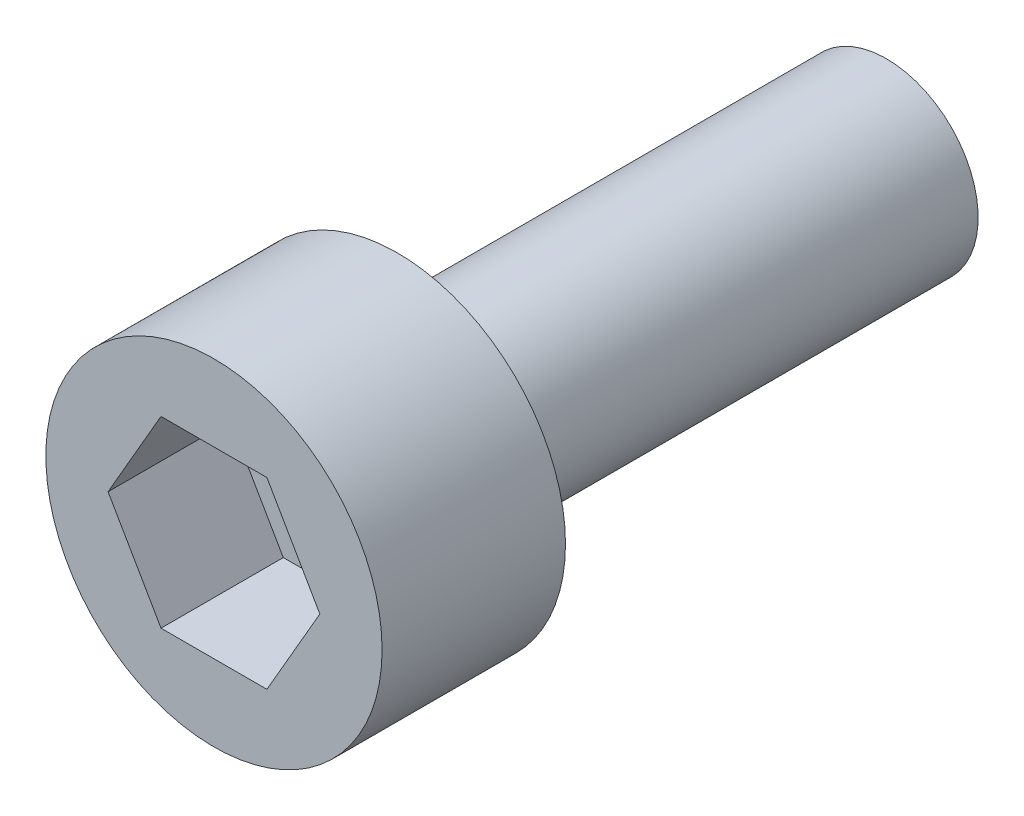
ISO-10303-21;
HEADER;
FILE_DESCRIPTION(('STEP AP214'),'2;1');
FILE_NAME('part.step','',(''),(''),'','','');
FILE_SCHEMA(('AUTOMOTIVE_DESIGN { 1 0 10303 214 1 1 1 1 }'));
ENDSEC;
DATA;
#1=APPLICATION_CONTEXT('core data for automotive mechanical design processes');
#2=APPLICATION_PROTOCOL_DEFINITION('international standard','automotive_design',2000,#1);
#3=PRODUCT_CONTEXT('',#1,'mechanical');
#4=PRODUCT('Part','Part','',(#3));
#5=PRODUCT_RELATED_PRODUCT_CATEGORY('part','',(#4));
#6=PRODUCT_DEFINITION_FORMATION('','',#4);
#7=PRODUCT_DEFINITION_CONTEXT('part definition',#1,'design');
#8=PRODUCT_DEFINITION('design','',#6,#7);
#9=PRODUCT_DEFINITION_SHAPE('','',#8);
#10=(LENGTH_UNIT() NAMED_UNIT(*) SI_UNIT(.MILLI.,.METRE.));
#11=(NAMED_UNIT(*) PLANE_ANGLE_UNIT() SI_UNIT($,.RADIAN.));
#12=(NAMED_UNIT(*) SI_UNIT($,.STERADIAN.) SOLID_ANGLE_UNIT());
#13=UNCERTAINTY_MEASURE_WITH_UNIT(LENGTH_MEASURE(1.E-05),#10,'distance_accuracy_value','');
#14=(GEOMETRIC_REPRESENTATION_CONTEXT(3) GLOBAL_UNCERTAINTY_ASSIGNED_CONTEXT((#13)) GLOBAL_UNIT_ASSIGNED_CONTEXT((#10,
#11,#12)) REPRESENTATION_CONTEXT('',''));
#15=CARTESIAN_POINT('',(0.,0.,0.));
#16=DIRECTION('',(0.,0.,1.));
#17=DIRECTION('',(1.,0.,0.));
#18=AXIS2_PLACEMENT_3D('',#15,#16,#17);
#19=CARTESIAN_POINT('',(0.866025403784438,-1.5,3.));
#20=DIRECTION('',(-0.866025403784439,0.5,0.));
#21=DIRECTION('',(-0.5,-0.866025403784439,0.));
#22=AXIS2_PLACEMENT_3D('',#19,#20,#21);
#23=PLANE('',#22);
#24=DIRECTION('',(0.,0.,-1.));
#25=VECTOR('',#24,1.);
#26=CARTESIAN_POINT('',(1.73205080756888,0.,3.));
#27=LINE('',#26,#25);
#28=CARTESIAN_POINT('',(1.73205080756888,0.,3.));
#29=VERTEX_POINT('',#28);
#30=CARTESIAN_POINT('',(1.73205080756888,0.,1.));
#31=VERTEX_POINT('',#30);
#32=EDGE_CURVE('E119',#29,#31,#27,.T.);
#33=ORIENTED_EDGE('',*,*,#32,.T.);
#34=DIRECTION('',(-0.5,-0.866025403784439,0.));
#35=VECTOR('',#34,1.);
#36=CARTESIAN_POINT('',(1.29903810567666,-0.75,1.));
#37=LINE('',#36,#35);
#38=CARTESIAN_POINT('',(0.866025403784438,-1.5,1.));
#39=VERTEX_POINT('',#38);
#40=EDGE_CURVE('E180',#31,#39,#37,.T.);
#41=ORIENTED_EDGE('',*,*,#40,.T.);
#42=DIRECTION('',(0.,0.,-1.));
#43=VECTOR('',#42,1.);
#44=CARTESIAN_POINT('',(0.866025403784438,-1.5,3.));
#45=LINE('',#44,#43);
#46=CARTESIAN_POINT('',(0.866025403784438,-1.5,3.));
#47=VERTEX_POINT('',#46);
#48=EDGE_CURVE('E197',#47,#39,#45,.T.);
#49=ORIENTED_EDGE('',*,*,#48,.F.);
#50=DIRECTION('',(0.5,0.866025403784439,0.));
#51=VECTOR('',#50,1.);
#52=CARTESIAN_POINT('',(0.866025403784438,-1.5,3.));
#53=LINE('',#52,#51);
#54=EDGE_CURVE('E186',#47,#29,#53,.T.);
#55=ORIENTED_EDGE('',*,*,#54,.T.);
#56=EDGE_LOOP('',(#33,#41,#49,#55));
#57=FACE_BOUND('',#56,.T.);
#58=ADVANCED_FACE('F40',(#57),#23,.T.);
#59=CARTESIAN_POINT('',(1.73205080756888,0.,3.));
#60=DIRECTION('',(-0.866025403784438,-0.5,0.));
#61=DIRECTION('',(0.5,-0.866025403784439,0.));
#62=AXIS2_PLACEMENT_3D('',#59,#60,#61);
#63=PLANE('',#62);
#64=DIRECTION('',(0.,0.,-1.));
#65=VECTOR('',#64,1.);
#66=CARTESIAN_POINT('',(0.866025403784438,1.5,3.));
#67=LINE('',#66,#65);
#68=CARTESIAN_POINT('',(0.866025403784438,1.5,3.));
#69=VERTEX_POINT('',#68);
#70=CARTESIAN_POINT('',(0.866025403784438,1.5,1.));
#71=VERTEX_POINT('',#70);
#72=EDGE_CURVE('E117',#69,#71,#67,.T.);
#73=ORIENTED_EDGE('',*,*,#72,.T.);
#74=DIRECTION('',(0.5,-0.866025403784438,0.));
#75=VECTOR('',#74,1.);
#76=CARTESIAN_POINT('',(1.29903810567666,0.750000000000001,1.));
#77=LINE('',#76,#75);
#78=EDGE_CURVE('E98',#71,#31,#77,.T.);
#79=ORIENTED_EDGE('',*,*,#78,.T.);
#80=ORIENTED_EDGE('',*,*,#32,.F.);
#81=DIRECTION('',(-0.5,0.866025403784438,0.));
#82=VECTOR('',#81,1.);
#83=CARTESIAN_POINT('',(1.73205080756888,0.,3.));
#84=LINE('',#83,#82);
#85=EDGE_CURVE('E188',#29,#69,#84,.T.);
#86=ORIENTED_EDGE('',*,*,#85,.T.);
#87=EDGE_LOOP('',(#73,#79,#80,#86));
#88=FACE_BOUND('',#87,.T.);
#89=ADVANCED_FACE('F145',(#88),#63,.T.);
#90=CARTESIAN_POINT('',(0.866025403784438,1.5,3.));
#91=DIRECTION('',(0.,-1.,0.));
#92=DIRECTION('',(0.,0.,-1.));
#93=AXIS2_PLACEMENT_3D('',#90,#91,#92);
#94=PLANE('',#93);
#95=DIRECTION('',(0.,0.,-1.));
#96=VECTOR('',#95,1.);
#97=CARTESIAN_POINT('',(-0.866025403784439,1.5,3.));
#98=LINE('',#97,#96);
#99=CARTESIAN_POINT('',(-0.866025403784439,1.5,3.));
#100=VERTEX_POINT('',#99);
#101=CARTESIAN_POINT('',(-0.866025403784439,1.5,1.));
#102=VERTEX_POINT('',#101);
#103=EDGE_CURVE('E108',#100,#102,#98,.T.);
#104=ORIENTED_EDGE('',*,*,#103,.T.);
#105=DIRECTION('',(1.,0.,0.));
#106=VECTOR('',#105,1.);
#107=CARTESIAN_POINT('',(0.,1.5,1.));
#108=LINE('',#107,#106);
#109=EDGE_CURVE('E93',#102,#71,#108,.T.);
#110=ORIENTED_EDGE('',*,*,#109,.T.);
#111=ORIENTED_EDGE('',*,*,#72,.F.);
#112=DIRECTION('',(-1.,0.,0.));
#113=VECTOR('',#112,1.);
#114=CARTESIAN_POINT('',(0.866025403784438,1.5,3.));
#115=LINE('',#114,#113);
#116=EDGE_CURVE('E116',#69,#100,#115,.T.);
#117=ORIENTED_EDGE('',*,*,#116,.T.);
#118=EDGE_LOOP('',(#104,#110,#111,#117));
#119=FACE_BOUND('',#118,.T.);
#120=ADVANCED_FACE('F114',(#119),#94,.T.);
#121=CARTESIAN_POINT('',(-0.866025403784439,1.5,3.));
#122=DIRECTION('',(0.866025403784438,-0.5,0.));
#123=DIRECTION('',(0.5,0.866025403784439,0.));
#124=AXIS2_PLACEMENT_3D('',#121,#122,#123);
#125=PLANE('',#124);
#126=DIRECTION('',(0.,0.,-1.));
#127=VECTOR('',#126,1.);
#128=CARTESIAN_POINT('',(-1.73205080756888,0.,3.));
#129=LINE('',#128,#127);
#130=CARTESIAN_POINT('',(-1.73205080756888,0.,3.));
#131=VERTEX_POINT('',#130);
#132=CARTESIAN_POINT('',(-1.73205080756888,0.,1.));
#133=VERTEX_POINT('',#132);
#134=EDGE_CURVE('E111',#131,#133,#129,.T.);
#135=ORIENTED_EDGE('',*,*,#134,.T.);
#136=DIRECTION('',(0.5,0.866025403784439,0.));
#137=VECTOR('',#136,1.);
#138=CARTESIAN_POINT('',(-1.29903810567666,0.75,1.));
#139=LINE('',#138,#137);
#140=EDGE_CURVE('E96',#133,#102,#139,.T.);
#141=ORIENTED_EDGE('',*,*,#140,.T.);
#142=ORIENTED_EDGE('',*,*,#103,.F.);
#143=DIRECTION('',(-0.5,-0.866025403784439,0.));
#144=VECTOR('',#143,1.);
#145=CARTESIAN_POINT('',(-0.866025403784439,1.5,3.));
#146=LINE('',#145,#144);
#147=EDGE_CURVE('E191',#100,#131,#146,.T.);
#148=ORIENTED_EDGE('',*,*,#147,.T.);
#149=EDGE_LOOP('',(#135,#141,#142,#148));
#150=FACE_BOUND('',#149,.T.);
#151=ADVANCED_FACE('F107',(#150),#125,.T.);
#152=CARTESIAN_POINT('',(-1.73205080756888,0.,3.));
#153=DIRECTION('',(0.866025403784439,0.5,0.));
#154=DIRECTION('',(-0.5,0.866025403784439,0.));
#155=AXIS2_PLACEMENT_3D('',#152,#153,#154);
#156=PLANE('',#155);
#157=DIRECTION('',(0.,0.,-1.));
#158=VECTOR('',#157,1.);
#159=CARTESIAN_POINT('',(-0.866025403784438,-1.5,3.));
#160=LINE('',#159,#158);
#161=CARTESIAN_POINT('',(-0.866025403784438,-1.5,3.));
#162=VERTEX_POINT('',#161);
#163=CARTESIAN_POINT('',(-0.866025403784438,-1.5,1.));
#164=VERTEX_POINT('',#163);
#165=EDGE_CURVE('E64',#162,#164,#160,.T.);
#166=ORIENTED_EDGE('',*,*,#165,.T.);
#167=DIRECTION('',(-0.5,0.866025403784439,0.));
#168=VECTOR('',#167,1.);
#169=CARTESIAN_POINT('',(-1.29903810567666,-0.75,1.));
#170=LINE('',#169,#168);
#171=EDGE_CURVE('E57',#164,#133,#170,.T.);
#172=ORIENTED_EDGE('',*,*,#171,.T.);
#173=ORIENTED_EDGE('',*,*,#134,.F.);
#174=DIRECTION('',(0.5,-0.866025403784438,0.));
#175=VECTOR('',#174,1.);
#176=CARTESIAN_POINT('',(-1.73205080756888,0.,3.));
#177=LINE('',#176,#175);
#178=EDGE_CURVE('E193',#131,#162,#177,.T.);
#179=ORIENTED_EDGE('',*,*,#178,.T.);
#180=EDGE_LOOP('',(#166,#172,#173,#179));
#181=FACE_BOUND('',#180,.T.);
#182=ADVANCED_FACE('F158',(#181),#156,.T.);
#183=CARTESIAN_POINT('',(-0.866025403784438,-1.5,3.));
#184=DIRECTION('',(0.,1.,0.));
#185=DIRECTION('',(-1.,0.,0.));
#186=AXIS2_PLACEMENT_3D('',#183,#184,#185);
#187=PLANE('',#186);
#188=ORIENTED_EDGE('',*,*,#48,.T.);
#189=DIRECTION('',(-1.,0.,0.));
#190=VECTOR('',#189,1.);
#191=CARTESIAN_POINT('',(0.,-1.5,1.));
#192=LINE('',#191,#190);
#193=EDGE_CURVE('E183',#39,#164,#192,.T.);
#194=ORIENTED_EDGE('',*,*,#193,.T.);
#195=ORIENTED_EDGE('',*,*,#165,.F.);
#196=DIRECTION('',(1.,0.,0.));
#197=VECTOR('',#196,1.);
#198=CARTESIAN_POINT('',(-0.866025403784438,-1.5,3.));
#199=LINE('',#198,#197);
#200=EDGE_CURVE('E195',#162,#47,#199,.T.);
#201=ORIENTED_EDGE('',*,*,#200,.T.);
#202=EDGE_LOOP('',(#188,#194,#195,#201));
#203=FACE_BOUND('',#202,.T.);
#204=ADVANCED_FACE('F141',(#203),#187,.T.);
#205=CARTESIAN_POINT('',(0.,0.,3.));
#206=DIRECTION('',(0.,0.,1.));
#207=DIRECTION('',(1.,0.,0.));
#208=AXIS2_PLACEMENT_3D('',#205,#206,#207);
#209=PLANE('',#208);
#210=CARTESIAN_POINT('',(0.,0.,3.));
#211=DIRECTION('',(0.,0.,1.));
#212=DIRECTION('',(1.,0.,0.));
#213=AXIS2_PLACEMENT_3D('',#210,#211,#212);
#214=CIRCLE('',#213,2.75);
#215=CARTESIAN_POINT('',(2.75,0.,3.));
#216=VERTEX_POINT('',#215);
#217=EDGE_CURVE('E49',#216,#216,#214,.T.);
#218=ORIENTED_EDGE('',*,*,#217,.T.);
#219=EDGE_LOOP('',(#218));
#220=FACE_BOUND('',#219,.T.);
#221=ORIENTED_EDGE('',*,*,#85,.F.);
#222=ORIENTED_EDGE('',*,*,#54,.F.);
#223=ORIENTED_EDGE('',*,*,#200,.F.);
#224=ORIENTED_EDGE('',*,*,#178,.F.);
#225=ORIENTED_EDGE('',*,*,#147,.F.);
#226=ORIENTED_EDGE('',*,*,#116,.F.);
#227=EDGE_LOOP('',(#221,#222,#223,#224,#225,#226));
#228=FACE_BOUND('',#227,.T.);
#229=ADVANCED_FACE('F134',(#220,#228),#209,.T.);
#230=CARTESIAN_POINT('',(0.,0.,0.));
#231=DIRECTION('',(0.,0.,1.));
#232=DIRECTION('',(1.,0.,0.));
#233=AXIS2_PLACEMENT_3D('',#230,#231,#232);
#234=PLANE('',#233);
#235=CARTESIAN_POINT('',(0.,0.,0.));
#236=DIRECTION('',(0.,0.,-1.));
#237=DIRECTION('',(-1.,0.,0.));
#238=AXIS2_PLACEMENT_3D('',#235,#236,#237);
#239=CIRCLE('',#238,1.5);
#240=CARTESIAN_POINT('',(-1.5,0.,0.));
#241=VERTEX_POINT('',#240);
#242=EDGE_CURVE('E11',#241,#241,#239,.T.);
#243=ORIENTED_EDGE('',*,*,#242,.F.);
#244=EDGE_LOOP('',(#243));
#245=FACE_BOUND('',#244,.T.);
#246=CARTESIAN_POINT('',(0.,0.,0.));
#247=DIRECTION('',(0.,0.,1.));
#248=DIRECTION('',(1.,0.,0.));
#249=AXIS2_PLACEMENT_3D('',#246,#247,#248);
#250=CIRCLE('',#249,2.75);
#251=CARTESIAN_POINT('',(2.75,0.,0.));
#252=VERTEX_POINT('',#251);
#253=EDGE_CURVE('E44',#252,#252,#250,.T.);
#254=ORIENTED_EDGE('',*,*,#253,.F.);
#255=EDGE_LOOP('',(#254));
#256=FACE_BOUND('',#255,.T.);
#257=ADVANCED_FACE('F132',(#245,#256),#234,.F.);
#258=CARTESIAN_POINT('',(0.,0.,3.));
#259=DIRECTION('',(0.,0.,-1.));
#260=DIRECTION('',(-1.,0.,0.));
#261=AXIS2_PLACEMENT_3D('',#258,#259,#260);
#262=CYLINDRICAL_SURFACE('',#261,2.75);
#263=ORIENTED_EDGE('',*,*,#217,.F.);
#264=EDGE_LOOP('',(#263));
#265=FACE_BOUND('',#264,.T.);
#266=ORIENTED_EDGE('',*,*,#253,.T.);
#267=EDGE_LOOP('',(#266));
#268=FACE_BOUND('',#267,.T.);
#269=ADVANCED_FACE('F42',(#265,#268),#262,.T.);
#270=CARTESIAN_POINT('',(0.,0.,1.));
#271=DIRECTION('',(0.,0.,-1.));
#272=DIRECTION('',(-1.,0.,0.));
#273=AXIS2_PLACEMENT_3D('',#270,#271,#272);
#274=PLANE('',#273);
#275=ORIENTED_EDGE('',*,*,#140,.F.);
#276=ORIENTED_EDGE('',*,*,#171,.F.);
#277=ORIENTED_EDGE('',*,*,#193,.F.);
#278=ORIENTED_EDGE('',*,*,#40,.F.);
#279=ORIENTED_EDGE('',*,*,#78,.F.);
#280=ORIENTED_EDGE('',*,*,#109,.F.);
#281=EDGE_LOOP('',(#275,#276,#277,#278,#279,#280));
#282=FACE_BOUND('',#281,.T.);
#283=ADVANCED_FACE('F95',(#282),#274,.F.);
#284=CARTESIAN_POINT('',(0.,0.,-8.));
#285=DIRECTION('',(0.,0.,1.));
#286=DIRECTION('',(1.,0.,0.));
#287=AXIS2_PLACEMENT_3D('',#284,#285,#286);
#288=CYLINDRICAL_SURFACE('',#287,1.5);
#289=CARTESIAN_POINT('',(0.,0.,-8.));
#290=DIRECTION('',(0.,0.,-1.));
#291=DIRECTION('',(-1.,0.,0.));
#292=AXIS2_PLACEMENT_3D('',#289,#290,#291);
#293=CIRCLE('',#292,1.5);
#294=CARTESIAN_POINT('',(-1.5,0.,-8.));
#295=VERTEX_POINT('',#294);
#296=EDGE_CURVE('E112',#295,#295,#293,.T.);
#297=ORIENTED_EDGE('',*,*,#296,.F.);
#298=EDGE_LOOP('',(#297));
#299=FACE_BOUND('',#298,.T.);
#300=ORIENTED_EDGE('',*,*,#242,.T.);
#301=EDGE_LOOP('',(#300));
#302=FACE_BOUND('',#301,.T.);
#303=ADVANCED_FACE('F166',(#299,#302),#288,.T.);
#304=CARTESIAN_POINT('',(0.,0.,-8.));
#305=DIRECTION('',(0.,0.,-1.));
#306=DIRECTION('',(-1.,0.,0.));
#307=AXIS2_PLACEMENT_3D('',#304,#305,#306);
#308=PLANE('',#307);
#309=ORIENTED_EDGE('',*,*,#296,.T.);
#310=EDGE_LOOP('',(#309));
#311=FACE_BOUND('',#310,.T.);
#312=ADVANCED_FACE('F169',(#311),#308,.T.);
#313=CLOSED_SHELL('',(#58,#89,#120,#151,#182,#204,#229,#257,#269,#283,#303,#312));
#314=MANIFOLD_SOLID_BREP('B2',#313);
#315=ADVANCED_BREP_SHAPE_REPRESENTATION('',(#18,#314),#14);
#316=SHAPE_DEFINITION_REPRESENTATION(#9,#315);
ENDSEC;
END-ISO-10303-21;
